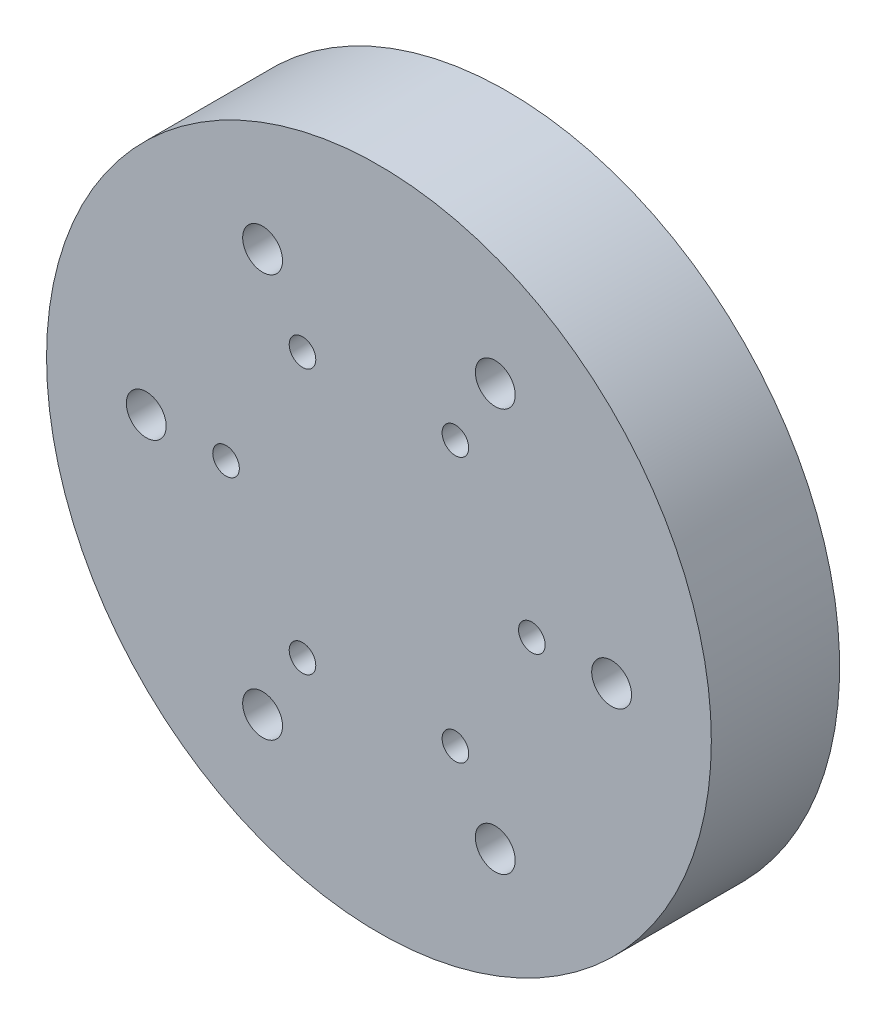
ISO-10303-21;
HEADER;
FILE_DESCRIPTION(('STEP AP214'),'2;1');
FILE_NAME('part.step','',(''),(''),'','','');
FILE_SCHEMA(('AUTOMOTIVE_DESIGN { 1 0 10303 214 1 1 1 1 }'));
ENDSEC;
DATA;
#1=APPLICATION_CONTEXT('core data for automotive mechanical design processes');
#2=APPLICATION_PROTOCOL_DEFINITION('international standard','automotive_design',2000,#1);
#3=PRODUCT_CONTEXT('',#1,'mechanical');
#4=PRODUCT('Part','Part','',(#3));
#5=PRODUCT_RELATED_PRODUCT_CATEGORY('part','',(#4));
#6=PRODUCT_DEFINITION_FORMATION('','',#4);
#7=PRODUCT_DEFINITION_CONTEXT('part definition',#1,'design');
#8=PRODUCT_DEFINITION('design','',#6,#7);
#9=PRODUCT_DEFINITION_SHAPE('','',#8);
#10=(LENGTH_UNIT() NAMED_UNIT(*) SI_UNIT(.MILLI.,.METRE.));
#11=(NAMED_UNIT(*) PLANE_ANGLE_UNIT() SI_UNIT($,.RADIAN.));
#12=(NAMED_UNIT(*) SI_UNIT($,.STERADIAN.) SOLID_ANGLE_UNIT());
#13=UNCERTAINTY_MEASURE_WITH_UNIT(LENGTH_MEASURE(1.E-05),#10,'distance_accuracy_value','');
#14=(GEOMETRIC_REPRESENTATION_CONTEXT(3) GLOBAL_UNCERTAINTY_ASSIGNED_CONTEXT((#13)) GLOBAL_UNIT_ASSIGNED_CONTEXT((#10,
#11,#12)) REPRESENTATION_CONTEXT('',''));
#15=CARTESIAN_POINT('',(0.,0.,0.));
#16=DIRECTION('',(0.,0.,1.));
#17=DIRECTION('',(1.,0.,0.));
#18=AXIS2_PLACEMENT_3D('',#15,#16,#17);
#19=CARTESIAN_POINT('',(0.,0.,20.));
#20=DIRECTION('',(0.,0.,-1.));
#21=DIRECTION('',(-1.,0.,0.));
#22=AXIS2_PLACEMENT_3D('',#19,#20,#21);
#23=CYLINDRICAL_SURFACE('',#22,50.);
#24=CARTESIAN_POINT('',(0.,0.,10.));
#25=DIRECTION('',(0.,0.,1.));
#26=DIRECTION('',(1.,0.,0.));
#27=AXIS2_PLACEMENT_3D('',#24,#25,#26);
#28=CIRCLE('',#27,50.);
#29=CARTESIAN_POINT('',(50.,0.,10.));
#30=VERTEX_POINT('',#29);
#31=EDGE_CURVE('E10',#30,#30,#28,.T.);
#32=ORIENTED_EDGE('',*,*,#31,.F.);
#33=EDGE_LOOP('',(#32));
#34=FACE_BOUND('',#33,.T.);
#35=CARTESIAN_POINT('',(0.,0.,-9.3));
#36=DIRECTION('',(0.,0.,-1.));
#37=DIRECTION('',(-1.,0.,0.));
#38=AXIS2_PLACEMENT_3D('',#35,#36,#37);
#39=CIRCLE('',#38,50.);
#40=CARTESIAN_POINT('',(-50.,0.,-9.3));
#41=VERTEX_POINT('',#40);
#42=EDGE_CURVE('E60',#41,#41,#39,.T.);
#43=ORIENTED_EDGE('',*,*,#42,.F.);
#44=EDGE_LOOP('',(#43));
#45=FACE_BOUND('',#44,.T.);
#46=ADVANCED_FACE('F39',(#34,#45),#23,.T.);
#47=CARTESIAN_POINT('',(17.4999999999997,-30.3108891324555,20.));
#48=DIRECTION('',(0.,0.,-1.));
#49=DIRECTION('',(-1.,0.,0.));
#50=AXIS2_PLACEMENT_3D('',#47,#48,#49);
#51=CYLINDRICAL_SURFACE('',#50,3.);
#52=CARTESIAN_POINT('',(17.4999999999997,-30.3108891324555,10.));
#53=DIRECTION('',(0.,0.,1.));
#54=DIRECTION('',(1.,0.,0.));
#55=AXIS2_PLACEMENT_3D('',#52,#53,#54);
#56=CIRCLE('',#55,3.);
#57=CARTESIAN_POINT('',(20.4999999999997,-30.3108891324555,10.));
#58=VERTEX_POINT('',#57);
#59=EDGE_CURVE('E47',#58,#58,#56,.T.);
#60=ORIENTED_EDGE('',*,*,#59,.T.);
#61=EDGE_LOOP('',(#60));
#62=FACE_BOUND('',#61,.T.);
#63=CARTESIAN_POINT('',(17.5000000000001,-30.3108891324553,-9.3));
#64=DIRECTION('',(0.,0.,-1.));
#65=DIRECTION('',(-1.,0.,0.));
#66=AXIS2_PLACEMENT_3D('',#63,#64,#65);
#67=CIRCLE('',#66,3.);
#68=CARTESIAN_POINT('',(14.5000000000001,-30.3108891324553,-9.3));
#69=VERTEX_POINT('',#68);
#70=EDGE_CURVE('E79',#69,#69,#67,.F.);
#71=ORIENTED_EDGE('',*,*,#70,.F.);
#72=EDGE_LOOP('',(#71));
#73=FACE_BOUND('',#72,.T.);
#74=ADVANCED_FACE('F118',(#62,#73),#51,.F.);
#75=CARTESIAN_POINT('',(35.,-2.44403693719019E-13,20.));
#76=DIRECTION('',(0.,0.,-1.));
#77=DIRECTION('',(-1.,0.,0.));
#78=AXIS2_PLACEMENT_3D('',#75,#76,#77);
#79=CYLINDRICAL_SURFACE('',#78,3.);
#80=CARTESIAN_POINT('',(35.,-2.44403693719019E-13,10.));
#81=DIRECTION('',(0.,0.,1.));
#82=DIRECTION('',(1.,0.,0.));
#83=AXIS2_PLACEMENT_3D('',#80,#81,#82);
#84=CIRCLE('',#83,3.);
#85=CARTESIAN_POINT('',(38.,-2.44403693719019E-13,10.));
#86=VERTEX_POINT('',#85);
#87=EDGE_CURVE('E52',#86,#86,#84,.T.);
#88=ORIENTED_EDGE('',*,*,#87,.T.);
#89=EDGE_LOOP('',(#88));
#90=FACE_BOUND('',#89,.T.);
#91=CARTESIAN_POINT('',(35.,0.,-9.3));
#92=DIRECTION('',(0.,0.,-1.));
#93=DIRECTION('',(-1.,0.,0.));
#94=AXIS2_PLACEMENT_3D('',#91,#92,#93);
#95=CIRCLE('',#94,3.);
#96=CARTESIAN_POINT('',(32.,0.,-9.3));
#97=VERTEX_POINT('',#96);
#98=EDGE_CURVE('E73',#97,#97,#95,.F.);
#99=ORIENTED_EDGE('',*,*,#98,.F.);
#100=EDGE_LOOP('',(#99));
#101=FACE_BOUND('',#100,.T.);
#102=ADVANCED_FACE('F113',(#90,#101),#79,.F.);
#103=CARTESIAN_POINT('',(17.5000000000001,30.3108891324553,20.));
#104=DIRECTION('',(0.,0.,-1.));
#105=DIRECTION('',(-1.,0.,0.));
#106=AXIS2_PLACEMENT_3D('',#103,#104,#105);
#107=CYLINDRICAL_SURFACE('',#106,3.);
#108=CARTESIAN_POINT('',(17.5000000000001,30.3108891324553,10.));
#109=DIRECTION('',(0.,0.,1.));
#110=DIRECTION('',(1.,0.,0.));
#111=AXIS2_PLACEMENT_3D('',#108,#109,#110);
#112=CIRCLE('',#111,3.);
#113=CARTESIAN_POINT('',(20.5000000000001,30.3108891324553,10.));
#114=VERTEX_POINT('',#113);
#115=EDGE_CURVE('E179',#114,#114,#112,.T.);
#116=ORIENTED_EDGE('',*,*,#115,.T.);
#117=EDGE_LOOP('',(#116));
#118=FACE_BOUND('',#117,.T.);
#119=CARTESIAN_POINT('',(17.4999999999997,30.3108891324555,-9.3));
#120=DIRECTION('',(0.,0.,-1.));
#121=DIRECTION('',(-1.,0.,0.));
#122=AXIS2_PLACEMENT_3D('',#119,#120,#121);
#123=CIRCLE('',#122,3.);
#124=CARTESIAN_POINT('',(14.4999999999997,30.3108891324555,-9.3));
#125=VERTEX_POINT('',#124);
#126=EDGE_CURVE('E88',#125,#125,#123,.F.);
#127=ORIENTED_EDGE('',*,*,#126,.F.);
#128=EDGE_LOOP('',(#127));
#129=FACE_BOUND('',#128,.T.);
#130=ADVANCED_FACE('F102',(#118,#129),#107,.F.);
#131=CARTESIAN_POINT('',(-17.4999999999999,30.3108891324554,20.));
#132=DIRECTION('',(0.,0.,-1.));
#133=DIRECTION('',(-1.,0.,0.));
#134=AXIS2_PLACEMENT_3D('',#131,#132,#133);
#135=CYLINDRICAL_SURFACE('',#134,3.);
#136=CARTESIAN_POINT('',(-17.4999999999999,30.3108891324554,10.));
#137=DIRECTION('',(0.,0.,1.));
#138=DIRECTION('',(1.,0.,0.));
#139=AXIS2_PLACEMENT_3D('',#136,#137,#138);
#140=CIRCLE('',#139,3.);
#141=CARTESIAN_POINT('',(-14.4999999999999,30.3108891324554,10.));
#142=VERTEX_POINT('',#141);
#143=EDGE_CURVE('E177',#142,#142,#140,.T.);
#144=ORIENTED_EDGE('',*,*,#143,.T.);
#145=EDGE_LOOP('',(#144));
#146=FACE_BOUND('',#145,.T.);
#147=CARTESIAN_POINT('',(-17.5000000000004,30.3108891324552,-9.3));
#148=DIRECTION('',(0.,0.,-1.));
#149=DIRECTION('',(-1.,0.,0.));
#150=AXIS2_PLACEMENT_3D('',#147,#148,#149);
#151=CIRCLE('',#150,3.);
#152=CARTESIAN_POINT('',(-20.5000000000004,30.3108891324552,-9.3));
#153=VERTEX_POINT('',#152);
#154=EDGE_CURVE('E43',#153,#153,#151,.F.);
#155=ORIENTED_EDGE('',*,*,#154,.F.);
#156=EDGE_LOOP('',(#155));
#157=FACE_BOUND('',#156,.T.);
#158=ADVANCED_FACE('F99',(#146,#157),#135,.F.);
#159=CARTESIAN_POINT('',(-35.,0.,20.));
#160=DIRECTION('',(0.,0.,-1.));
#161=DIRECTION('',(-1.,0.,0.));
#162=AXIS2_PLACEMENT_3D('',#159,#160,#161);
#163=CYLINDRICAL_SURFACE('',#162,3.);
#164=CARTESIAN_POINT('',(-35.,0.,10.));
#165=DIRECTION('',(0.,0.,1.));
#166=DIRECTION('',(1.,0.,0.));
#167=AXIS2_PLACEMENT_3D('',#164,#165,#166);
#168=CIRCLE('',#167,3.);
#169=CARTESIAN_POINT('',(-32.,0.,10.));
#170=VERTEX_POINT('',#169);
#171=EDGE_CURVE('E174',#170,#170,#168,.T.);
#172=ORIENTED_EDGE('',*,*,#171,.T.);
#173=EDGE_LOOP('',(#172));
#174=FACE_BOUND('',#173,.T.);
#175=CARTESIAN_POINT('',(-35.,0.,-9.3));
#176=DIRECTION('',(0.,0.,-1.));
#177=DIRECTION('',(-1.,0.,0.));
#178=AXIS2_PLACEMENT_3D('',#175,#176,#177);
#179=CIRCLE('',#178,3.);
#180=CARTESIAN_POINT('',(-38.,0.,-9.3));
#181=VERTEX_POINT('',#180);
#182=EDGE_CURVE('E64',#181,#181,#179,.F.);
#183=ORIENTED_EDGE('',*,*,#182,.F.);
#184=EDGE_LOOP('',(#183));
#185=FACE_BOUND('',#184,.T.);
#186=ADVANCED_FACE('F101',(#174,#185),#163,.F.);
#187=CARTESIAN_POINT('',(-17.5000000000004,-30.3108891324552,20.));
#188=DIRECTION('',(0.,0.,-1.));
#189=DIRECTION('',(-1.,0.,0.));
#190=AXIS2_PLACEMENT_3D('',#187,#188,#189);
#191=CYLINDRICAL_SURFACE('',#190,3.);
#192=CARTESIAN_POINT('',(-17.5000000000004,-30.3108891324552,10.));
#193=DIRECTION('',(0.,0.,1.));
#194=DIRECTION('',(1.,0.,0.));
#195=AXIS2_PLACEMENT_3D('',#192,#193,#194);
#196=CIRCLE('',#195,3.);
#197=CARTESIAN_POINT('',(-14.5000000000004,-30.3108891324552,10.));
#198=VERTEX_POINT('',#197);
#199=EDGE_CURVE('E171',#198,#198,#196,.T.);
#200=ORIENTED_EDGE('',*,*,#199,.T.);
#201=EDGE_LOOP('',(#200));
#202=FACE_BOUND('',#201,.T.);
#203=CARTESIAN_POINT('',(-17.4999999999999,-30.3108891324554,-9.3));
#204=DIRECTION('',(0.,0.,-1.));
#205=DIRECTION('',(-1.,0.,0.));
#206=AXIS2_PLACEMENT_3D('',#203,#204,#205);
#207=CIRCLE('',#206,3.);
#208=CARTESIAN_POINT('',(-20.4999999999999,-30.3108891324554,-9.3));
#209=VERTEX_POINT('',#208);
#210=EDGE_CURVE('E67',#209,#209,#207,.F.);
#211=ORIENTED_EDGE('',*,*,#210,.F.);
#212=EDGE_LOOP('',(#211));
#213=FACE_BOUND('',#212,.T.);
#214=ADVANCED_FACE('F110',(#202,#213),#191,.F.);
#215=CARTESIAN_POINT('',(23.,-1.60608141586784E-13,20.));
#216=DIRECTION('',(0.,0.,-1.));
#217=DIRECTION('',(-1.,0.,0.));
#218=AXIS2_PLACEMENT_3D('',#215,#216,#217);
#219=CYLINDRICAL_SURFACE('',#218,2.);
#220=CARTESIAN_POINT('',(23.,-1.60608141586784E-13,10.));
#221=DIRECTION('',(0.,0.,1.));
#222=DIRECTION('',(1.,0.,0.));
#223=AXIS2_PLACEMENT_3D('',#220,#221,#222);
#224=CIRCLE('',#223,2.);
#225=CARTESIAN_POINT('',(25.,-1.60608141586784E-13,10.));
#226=VERTEX_POINT('',#225);
#227=EDGE_CURVE('E168',#226,#226,#224,.T.);
#228=ORIENTED_EDGE('',*,*,#227,.T.);
#229=EDGE_LOOP('',(#228));
#230=FACE_BOUND('',#229,.T.);
#231=CARTESIAN_POINT('',(23.,0.,-9.3));
#232=DIRECTION('',(0.,0.,-1.));
#233=DIRECTION('',(-1.,0.,0.));
#234=AXIS2_PLACEMENT_3D('',#231,#232,#233);
#235=CIRCLE('',#234,2.);
#236=CARTESIAN_POINT('',(21.,0.,-9.3));
#237=VERTEX_POINT('',#236);
#238=EDGE_CURVE('E85',#237,#237,#235,.F.);
#239=ORIENTED_EDGE('',*,*,#238,.F.);
#240=EDGE_LOOP('',(#239));
#241=FACE_BOUND('',#240,.T.);
#242=ADVANCED_FACE('F221',(#230,#241),#219,.F.);
#243=CARTESIAN_POINT('',(11.5000000000001,19.918584287042,20.));
#244=DIRECTION('',(0.,0.,-1.));
#245=DIRECTION('',(-1.,0.,0.));
#246=AXIS2_PLACEMENT_3D('',#243,#244,#245);
#247=CYLINDRICAL_SURFACE('',#246,2.);
#248=CARTESIAN_POINT('',(11.5000000000001,19.918584287042,10.));
#249=DIRECTION('',(0.,0.,1.));
#250=DIRECTION('',(1.,0.,0.));
#251=AXIS2_PLACEMENT_3D('',#248,#249,#250);
#252=CIRCLE('',#251,2.);
#253=CARTESIAN_POINT('',(13.5000000000001,19.918584287042,10.));
#254=VERTEX_POINT('',#253);
#255=EDGE_CURVE('E165',#254,#254,#252,.T.);
#256=ORIENTED_EDGE('',*,*,#255,.T.);
#257=EDGE_LOOP('',(#256));
#258=FACE_BOUND('',#257,.T.);
#259=CARTESIAN_POINT('',(11.4999999999998,19.9185842870422,-9.3));
#260=DIRECTION('',(0.,0.,-1.));
#261=DIRECTION('',(-1.,0.,0.));
#262=AXIS2_PLACEMENT_3D('',#259,#260,#261);
#263=CIRCLE('',#262,2.);
#264=CARTESIAN_POINT('',(9.49999999999981,19.9185842870422,-9.3));
#265=VERTEX_POINT('',#264);
#266=EDGE_CURVE('E90',#265,#265,#263,.F.);
#267=ORIENTED_EDGE('',*,*,#266,.F.);
#268=EDGE_LOOP('',(#267));
#269=FACE_BOUND('',#268,.T.);
#270=ADVANCED_FACE('F226',(#258,#269),#247,.F.);
#271=CARTESIAN_POINT('',(-11.5,19.9185842870421,20.));
#272=DIRECTION('',(0.,0.,-1.));
#273=DIRECTION('',(-1.,0.,0.));
#274=AXIS2_PLACEMENT_3D('',#271,#272,#273);
#275=CYLINDRICAL_SURFACE('',#274,2.);
#276=CARTESIAN_POINT('',(-11.5,19.9185842870421,10.));
#277=DIRECTION('',(0.,0.,1.));
#278=DIRECTION('',(1.,0.,0.));
#279=AXIS2_PLACEMENT_3D('',#276,#277,#278);
#280=CIRCLE('',#279,2.);
#281=CARTESIAN_POINT('',(-9.49999999999995,19.9185842870421,10.));
#282=VERTEX_POINT('',#281);
#283=EDGE_CURVE('E162',#282,#282,#280,.T.);
#284=ORIENTED_EDGE('',*,*,#283,.T.);
#285=EDGE_LOOP('',(#284));
#286=FACE_BOUND('',#285,.T.);
#287=CARTESIAN_POINT('',(-11.5000000000002,19.918584287042,-9.3));
#288=DIRECTION('',(0.,0.,-1.));
#289=DIRECTION('',(-1.,0.,0.));
#290=AXIS2_PLACEMENT_3D('',#287,#288,#289);
#291=CIRCLE('',#290,2.);
#292=CARTESIAN_POINT('',(-13.5000000000002,19.918584287042,-9.3));
#293=VERTEX_POINT('',#292);
#294=EDGE_CURVE('E70',#293,#293,#291,.F.);
#295=ORIENTED_EDGE('',*,*,#294,.F.);
#296=EDGE_LOOP('',(#295));
#297=FACE_BOUND('',#296,.T.);
#298=ADVANCED_FACE('F232',(#286,#297),#275,.F.);
#299=CARTESIAN_POINT('',(-23.,0.,20.));
#300=DIRECTION('',(0.,0.,-1.));
#301=DIRECTION('',(-1.,0.,0.));
#302=AXIS2_PLACEMENT_3D('',#299,#300,#301);
#303=CYLINDRICAL_SURFACE('',#302,2.);
#304=CARTESIAN_POINT('',(-23.,0.,10.));
#305=DIRECTION('',(0.,0.,1.));
#306=DIRECTION('',(1.,0.,0.));
#307=AXIS2_PLACEMENT_3D('',#304,#305,#306);
#308=CIRCLE('',#307,2.);
#309=CARTESIAN_POINT('',(-21.,0.,10.));
#310=VERTEX_POINT('',#309);
#311=EDGE_CURVE('E159',#310,#310,#308,.T.);
#312=ORIENTED_EDGE('',*,*,#311,.T.);
#313=EDGE_LOOP('',(#312));
#314=FACE_BOUND('',#313,.T.);
#315=CARTESIAN_POINT('',(-23.,0.,-9.3));
#316=DIRECTION('',(0.,0.,-1.));
#317=DIRECTION('',(-1.,0.,0.));
#318=AXIS2_PLACEMENT_3D('',#315,#316,#317);
#319=CIRCLE('',#318,2.);
#320=CARTESIAN_POINT('',(-25.,0.,-9.3));
#321=VERTEX_POINT('',#320);
#322=EDGE_CURVE('E61',#321,#321,#319,.F.);
#323=ORIENTED_EDGE('',*,*,#322,.F.);
#324=EDGE_LOOP('',(#323));
#325=FACE_BOUND('',#324,.T.);
#326=ADVANCED_FACE('F199',(#314,#325),#303,.F.);
#327=CARTESIAN_POINT('',(-11.5000000000002,-19.918584287042,20.));
#328=DIRECTION('',(0.,0.,-1.));
#329=DIRECTION('',(-1.,0.,0.));
#330=AXIS2_PLACEMENT_3D('',#327,#328,#329);
#331=CYLINDRICAL_SURFACE('',#330,2.);
#332=CARTESIAN_POINT('',(-11.5000000000002,-19.918584287042,10.));
#333=DIRECTION('',(0.,0.,1.));
#334=DIRECTION('',(1.,0.,0.));
#335=AXIS2_PLACEMENT_3D('',#332,#333,#334);
#336=CIRCLE('',#335,2.);
#337=CARTESIAN_POINT('',(-9.50000000000023,-19.918584287042,10.));
#338=VERTEX_POINT('',#337);
#339=EDGE_CURVE('E59',#338,#338,#336,.T.);
#340=ORIENTED_EDGE('',*,*,#339,.T.);
#341=EDGE_LOOP('',(#340));
#342=FACE_BOUND('',#341,.T.);
#343=CARTESIAN_POINT('',(-11.5,-19.9185842870421,-9.3));
#344=DIRECTION('',(0.,0.,-1.));
#345=DIRECTION('',(-1.,0.,0.));
#346=AXIS2_PLACEMENT_3D('',#343,#344,#345);
#347=CIRCLE('',#346,2.);
#348=CARTESIAN_POINT('',(-13.5,-19.9185842870421,-9.3));
#349=VERTEX_POINT('',#348);
#350=EDGE_CURVE('E82',#349,#349,#347,.F.);
#351=ORIENTED_EDGE('',*,*,#350,.F.);
#352=EDGE_LOOP('',(#351));
#353=FACE_BOUND('',#352,.T.);
#354=ADVANCED_FACE('F41',(#342,#353),#331,.F.);
#355=CARTESIAN_POINT('',(11.4999999999998,-19.9185842870422,20.));
#356=DIRECTION('',(0.,0.,-1.));
#357=DIRECTION('',(-1.,0.,0.));
#358=AXIS2_PLACEMENT_3D('',#355,#356,#357);
#359=CYLINDRICAL_SURFACE('',#358,2.);
#360=CARTESIAN_POINT('',(11.4999999999998,-19.9185842870422,10.));
#361=DIRECTION('',(0.,0.,1.));
#362=DIRECTION('',(1.,0.,0.));
#363=AXIS2_PLACEMENT_3D('',#360,#361,#362);
#364=CIRCLE('',#363,2.);
#365=CARTESIAN_POINT('',(13.4999999999998,-19.9185842870422,10.));
#366=VERTEX_POINT('',#365);
#367=EDGE_CURVE('E56',#366,#366,#364,.T.);
#368=ORIENTED_EDGE('',*,*,#367,.T.);
#369=EDGE_LOOP('',(#368));
#370=FACE_BOUND('',#369,.T.);
#371=CARTESIAN_POINT('',(11.5000000000001,-19.918584287042,-9.3));
#372=DIRECTION('',(0.,0.,-1.));
#373=DIRECTION('',(-1.,0.,0.));
#374=AXIS2_PLACEMENT_3D('',#371,#372,#373);
#375=CIRCLE('',#374,2.);
#376=CARTESIAN_POINT('',(9.50000000000009,-19.918584287042,-9.3));
#377=VERTEX_POINT('',#376);
#378=EDGE_CURVE('E76',#377,#377,#375,.F.);
#379=ORIENTED_EDGE('',*,*,#378,.F.);
#380=EDGE_LOOP('',(#379));
#381=FACE_BOUND('',#380,.T.);
#382=ADVANCED_FACE('F129',(#370,#381),#359,.F.);
#383=CARTESIAN_POINT('',(0.,0.,10.));
#384=DIRECTION('',(0.,0.,1.));
#385=DIRECTION('',(1.,0.,0.));
#386=AXIS2_PLACEMENT_3D('',#383,#384,#385);
#387=PLANE('',#386);
#388=ORIENTED_EDGE('',*,*,#367,.F.);
#389=EDGE_LOOP('',(#388));
#390=FACE_BOUND('',#389,.T.);
#391=ORIENTED_EDGE('',*,*,#339,.F.);
#392=EDGE_LOOP('',(#391));
#393=FACE_BOUND('',#392,.T.);
#394=ORIENTED_EDGE('',*,*,#311,.F.);
#395=EDGE_LOOP('',(#394));
#396=FACE_BOUND('',#395,.T.);
#397=ORIENTED_EDGE('',*,*,#283,.F.);
#398=EDGE_LOOP('',(#397));
#399=FACE_BOUND('',#398,.T.);
#400=ORIENTED_EDGE('',*,*,#255,.F.);
#401=EDGE_LOOP('',(#400));
#402=FACE_BOUND('',#401,.T.);
#403=ORIENTED_EDGE('',*,*,#227,.F.);
#404=EDGE_LOOP('',(#403));
#405=FACE_BOUND('',#404,.T.);
#406=ORIENTED_EDGE('',*,*,#199,.F.);
#407=EDGE_LOOP('',(#406));
#408=FACE_BOUND('',#407,.T.);
#409=ORIENTED_EDGE('',*,*,#171,.F.);
#410=EDGE_LOOP('',(#409));
#411=FACE_BOUND('',#410,.T.);
#412=ORIENTED_EDGE('',*,*,#143,.F.);
#413=EDGE_LOOP('',(#412));
#414=FACE_BOUND('',#413,.T.);
#415=ORIENTED_EDGE('',*,*,#115,.F.);
#416=EDGE_LOOP('',(#415));
#417=FACE_BOUND('',#416,.T.);
#418=ORIENTED_EDGE('',*,*,#87,.F.);
#419=EDGE_LOOP('',(#418));
#420=FACE_BOUND('',#419,.T.);
#421=ORIENTED_EDGE('',*,*,#59,.F.);
#422=EDGE_LOOP('',(#421));
#423=FACE_BOUND('',#422,.T.);
#424=ORIENTED_EDGE('',*,*,#31,.T.);
#425=EDGE_LOOP('',(#424));
#426=FACE_BOUND('',#425,.T.);
#427=ADVANCED_FACE('F143',(#390,#393,#396,#399,#402,#405,#408,#411,#414,#417,#420,#423,#426),
#387,.T.);
#428=CARTESIAN_POINT('',(0.,0.,-9.3));
#429=DIRECTION('',(0.,0.,-1.));
#430=DIRECTION('',(-1.,0.,0.));
#431=AXIS2_PLACEMENT_3D('',#428,#429,#430);
#432=PLANE('',#431);
#433=ORIENTED_EDGE('',*,*,#154,.T.);
#434=EDGE_LOOP('',(#433));
#435=FACE_BOUND('',#434,.T.);
#436=ORIENTED_EDGE('',*,*,#266,.T.);
#437=EDGE_LOOP('',(#436));
#438=FACE_BOUND('',#437,.T.);
#439=ORIENTED_EDGE('',*,*,#126,.T.);
#440=EDGE_LOOP('',(#439));
#441=FACE_BOUND('',#440,.T.);
#442=ORIENTED_EDGE('',*,*,#238,.T.);
#443=EDGE_LOOP('',(#442));
#444=FACE_BOUND('',#443,.T.);
#445=ORIENTED_EDGE('',*,*,#350,.T.);
#446=EDGE_LOOP('',(#445));
#447=FACE_BOUND('',#446,.T.);
#448=ORIENTED_EDGE('',*,*,#70,.T.);
#449=EDGE_LOOP('',(#448));
#450=FACE_BOUND('',#449,.T.);
#451=ORIENTED_EDGE('',*,*,#378,.T.);
#452=EDGE_LOOP('',(#451));
#453=FACE_BOUND('',#452,.T.);
#454=ORIENTED_EDGE('',*,*,#98,.T.);
#455=EDGE_LOOP('',(#454));
#456=FACE_BOUND('',#455,.T.);
#457=ORIENTED_EDGE('',*,*,#294,.T.);
#458=EDGE_LOOP('',(#457));
#459=FACE_BOUND('',#458,.T.);
#460=ORIENTED_EDGE('',*,*,#210,.T.);
#461=EDGE_LOOP('',(#460));
#462=FACE_BOUND('',#461,.T.);
#463=ORIENTED_EDGE('',*,*,#182,.T.);
#464=EDGE_LOOP('',(#463));
#465=FACE_BOUND('',#464,.T.);
#466=ORIENTED_EDGE('',*,*,#322,.T.);
#467=EDGE_LOOP('',(#466));
#468=FACE_BOUND('',#467,.T.);
#469=ORIENTED_EDGE('',*,*,#42,.T.);
#470=EDGE_LOOP('',(#469));
#471=FACE_BOUND('',#470,.T.);
#472=ADVANCED_FACE('F97',(#435,#438,#441,#444,#447,#450,#453,#456,#459,#462,#465,#468,#471),
#432,.T.);
#473=CLOSED_SHELL('',(#46,#74,#102,#130,#158,#186,#214,#242,#270,#298,#326,#354,#382,#427,#472));
#474=MANIFOLD_SOLID_BREP('B2',#473);
#475=ADVANCED_BREP_SHAPE_REPRESENTATION('',(#18,#474),#14);
#476=SHAPE_DEFINITION_REPRESENTATION(#9,#475);
ENDSEC;
END-ISO-10303-21;
